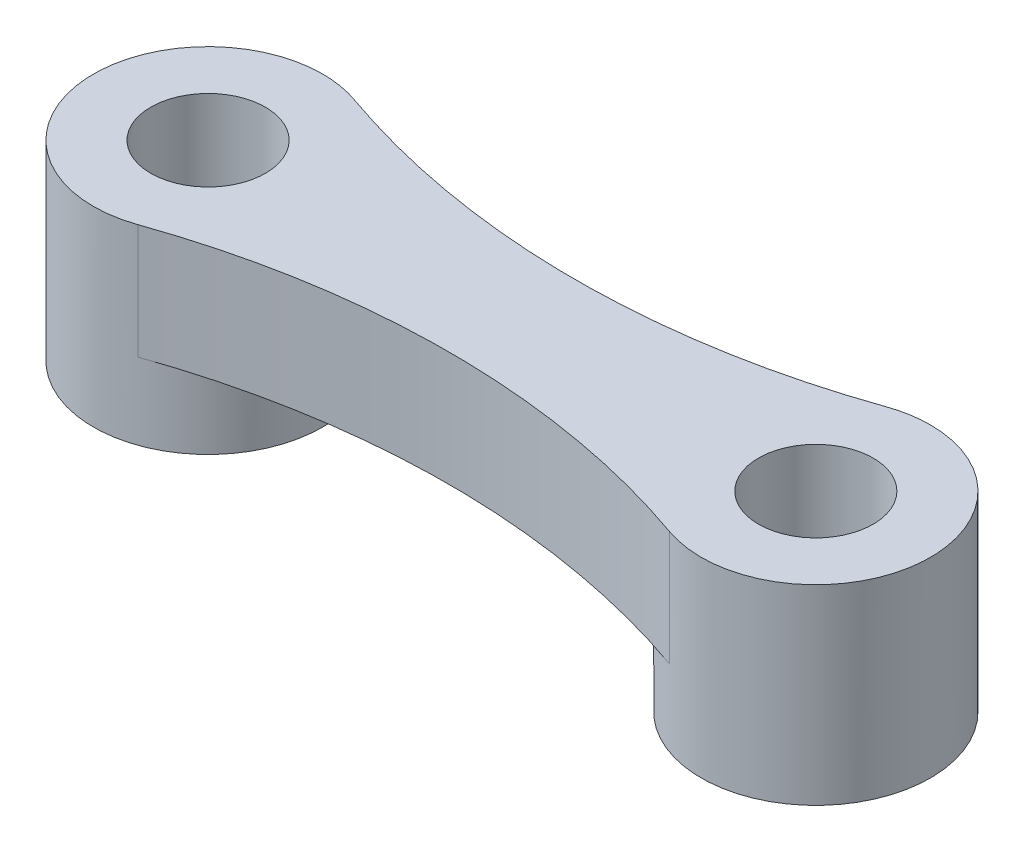
ISO-10303-21;
HEADER;
FILE_DESCRIPTION(('STEP AP214'),'2;1');
FILE_NAME('part.step','',(''),(''),'','','');
FILE_SCHEMA(('AUTOMOTIVE_DESIGN { 1 0 10303 214 1 1 1 1 }'));
ENDSEC;
DATA;
#1=APPLICATION_CONTEXT('core data for automotive mechanical design processes');
#2=APPLICATION_PROTOCOL_DEFINITION('international standard','automotive_design',2000,#1);
#3=PRODUCT_CONTEXT('',#1,'mechanical');
#4=PRODUCT('Part','Part','',(#3));
#5=PRODUCT_RELATED_PRODUCT_CATEGORY('part','',(#4));
#6=PRODUCT_DEFINITION_FORMATION('','',#4);
#7=PRODUCT_DEFINITION_CONTEXT('part definition',#1,'design');
#8=PRODUCT_DEFINITION('design','',#6,#7);
#9=PRODUCT_DEFINITION_SHAPE('','',#8);
#10=(LENGTH_UNIT() NAMED_UNIT(*) SI_UNIT(.MILLI.,.METRE.));
#11=(NAMED_UNIT(*) PLANE_ANGLE_UNIT() SI_UNIT($,.RADIAN.));
#12=(NAMED_UNIT(*) SI_UNIT($,.STERADIAN.) SOLID_ANGLE_UNIT());
#13=UNCERTAINTY_MEASURE_WITH_UNIT(LENGTH_MEASURE(1.E-05),#10,'distance_accuracy_value','');
#14=(GEOMETRIC_REPRESENTATION_CONTEXT(3) GLOBAL_UNCERTAINTY_ASSIGNED_CONTEXT((#13)) GLOBAL_UNIT_ASSIGNED_CONTEXT((#10,
#11,#12)) REPRESENTATION_CONTEXT('',''));
#15=CARTESIAN_POINT('',(0.,0.,0.));
#16=DIRECTION('',(0.,0.,1.));
#17=DIRECTION('',(1.,0.,0.));
#18=AXIS2_PLACEMENT_3D('',#15,#16,#17);
#19=CARTESIAN_POINT('',(-3.97499999999501,0.,-11.3225162840142));
#20=DIRECTION('',(0.,-1.,0.));
#21=DIRECTION('',(0.,0.,-1.));
#22=AXIS2_PLACEMENT_3D('',#19,#20,#21);
#23=PLANE('',#22);
#24=CARTESIAN_POINT('',(0.,0.,22.645032568));
#25=DIRECTION('',(0.,1.,0.));
#26=DIRECTION('',(0.,0.,1.));
#27=AXIS2_PLACEMENT_3D('',#24,#25,#26);
#28=CIRCLE('',#27,21.0000000000602);
#29=CARTESIAN_POINT('',(6.95624999994292,0.,2.83062907096401));
#30=VERTEX_POINT('',#29);
#31=CARTESIAN_POINT('',(-6.95624999998503,0.,2.83062907104261));
#32=VERTEX_POINT('',#31);
#33=EDGE_CURVE('E84',#30,#32,#28,.T.);
#34=ORIENTED_EDGE('',*,*,#33,.T.);
#35=CARTESIAN_POINT('',(-7.95,0.,0.));
#36=DIRECTION('',(0.,-1.,0.));
#37=DIRECTION('',(0.,0.,-1.));
#38=AXIS2_PLACEMENT_3D('',#35,#36,#37);
#39=CIRCLE('',#38,3.);
#40=CARTESIAN_POINT('',(-6.95625000000499,0.,-2.8306290709858));
#41=VERTEX_POINT('',#40);
#42=EDGE_CURVE('E135',#41,#32,#39,.T.);
#43=ORIENTED_EDGE('',*,*,#42,.F.);
#44=CARTESIAN_POINT('',(9.97812943381869E-12,0.,-22.6450325680284));
#45=DIRECTION('',(0.,1.,0.));
#46=DIRECTION('',(0.,0.,1.));
#47=AXIS2_PLACEMENT_3D('',#44,#45,#46);
#48=CIRCLE('',#47,21.0000000000903);
#49=CARTESIAN_POINT('',(6.95624999992546,0.,-2.83062907101469));
#50=VERTEX_POINT('',#49);
#51=EDGE_CURVE('E119',#41,#50,#48,.T.);
#52=ORIENTED_EDGE('',*,*,#51,.T.);
#53=CARTESIAN_POINT('',(7.95,0.,0.));
#54=DIRECTION('',(0.,-1.,0.));
#55=DIRECTION('',(0.,0.,-1.));
#56=AXIS2_PLACEMENT_3D('',#53,#54,#55);
#57=CIRCLE('',#56,3.);
#58=EDGE_CURVE('E98',#30,#50,#57,.T.);
#59=ORIENTED_EDGE('',*,*,#58,.F.);
#60=EDGE_LOOP('',(#34,#43,#52,#59));
#61=FACE_BOUND('',#60,.T.);
#62=ADVANCED_FACE('F45',(#61),#23,.T.);
#63=CARTESIAN_POINT('',(-7.95,3.,0.));
#64=DIRECTION('',(0.,-1.,0.));
#65=DIRECTION('',(0.,0.,-1.));
#66=AXIS2_PLACEMENT_3D('',#63,#64,#65);
#67=CYLINDRICAL_SURFACE('',#66,3.00000000006022);
#68=DIRECTION('',(0.,-1.,0.));
#69=VECTOR('',#68,1.);
#70=CARTESIAN_POINT('',(-6.95624999998504,3.,-2.83062907104261));
#71=LINE('',#70,#69);
#72=CARTESIAN_POINT('',(-6.95624999998504,3.,-2.83062907104261));
#73=VERTEX_POINT('',#72);
#74=EDGE_CURVE('E49',#73,#41,#71,.T.);
#75=ORIENTED_EDGE('',*,*,#74,.T.);
#76=ORIENTED_EDGE('',*,*,#42,.T.);
#77=DIRECTION('',(0.,-1.,0.));
#78=VECTOR('',#77,1.);
#79=CARTESIAN_POINT('',(-6.95624999998503,3.,2.83062907104261));
#80=LINE('',#79,#78);
#81=CARTESIAN_POINT('',(-6.95624999998503,3.,2.83062907104261));
#82=VERTEX_POINT('',#81);
#83=EDGE_CURVE('E11',#82,#32,#80,.T.);
#84=ORIENTED_EDGE('',*,*,#83,.F.);
#85=CARTESIAN_POINT('',(-7.95,3.,0.));
#86=DIRECTION('',(0.,-1.,0.));
#87=DIRECTION('',(0.,0.,-1.));
#88=AXIS2_PLACEMENT_3D('',#85,#86,#87);
#89=CIRCLE('',#88,3.00000000006022);
#90=EDGE_CURVE('E111',#82,#73,#89,.T.);
#91=ORIENTED_EDGE('',*,*,#90,.T.);
#92=EDGE_LOOP('',(#75,#76,#84,#91));
#93=FACE_BOUND('',#92,.T.);
#94=CARTESIAN_POINT('',(-7.95,-2.,0.));
#95=DIRECTION('',(0.,-1.,0.));
#96=DIRECTION('',(0.,0.,-1.));
#97=AXIS2_PLACEMENT_3D('',#94,#95,#96);
#98=CIRCLE('',#97,3.);
#99=CARTESIAN_POINT('',(-7.95,-2.,-3.));
#100=VERTEX_POINT('',#99);
#101=EDGE_CURVE('E129',#100,#100,#98,.T.);
#102=ORIENTED_EDGE('',*,*,#101,.F.);
#103=EDGE_LOOP('',(#102));
#104=FACE_BOUND('',#103,.T.);
#105=ADVANCED_FACE('F47',(#93,#104),#67,.T.);
#106=CARTESIAN_POINT('',(0.,3.,22.645032568));
#107=DIRECTION('',(0.,-1.,0.));
#108=DIRECTION('',(0.,0.,-1.));
#109=AXIS2_PLACEMENT_3D('',#106,#107,#108);
#110=CYLINDRICAL_SURFACE('',#109,21.0000000000602);
#111=ORIENTED_EDGE('',*,*,#33,.F.);
#112=DIRECTION('',(0.,-1.,0.));
#113=VECTOR('',#112,1.);
#114=CARTESIAN_POINT('',(6.95624999992297,3.,2.83062907102082));
#115=LINE('',#114,#113);
#116=CARTESIAN_POINT('',(6.95624999992297,3.,2.83062907102082));
#117=VERTEX_POINT('',#116);
#118=EDGE_CURVE('E56',#117,#30,#115,.T.);
#119=ORIENTED_EDGE('',*,*,#118,.F.);
#120=CARTESIAN_POINT('',(0.,3.,22.645032568));
#121=DIRECTION('',(0.,1.,0.));
#122=DIRECTION('',(0.,0.,1.));
#123=AXIS2_PLACEMENT_3D('',#120,#121,#122);
#124=CIRCLE('',#123,21.0000000000602);
#125=EDGE_CURVE('E105',#117,#82,#124,.T.);
#126=ORIENTED_EDGE('',*,*,#125,.T.);
#127=ORIENTED_EDGE('',*,*,#83,.T.);
#128=EDGE_LOOP('',(#111,#119,#126,#127));
#129=FACE_BOUND('',#128,.T.);
#130=ADVANCED_FACE('F185',(#129),#110,.F.);
#131=CARTESIAN_POINT('',(7.94999999991909,3.,3.50267000011644E-12));
#132=DIRECTION('',(0.,-1.,0.));
#133=DIRECTION('',(0.,0.,-1.));
#134=AXIS2_PLACEMENT_3D('',#131,#132,#133);
#135=CYLINDRICAL_SURFACE('',#134,3.00000000003011);
#136=ORIENTED_EDGE('',*,*,#118,.T.);
#137=ORIENTED_EDGE('',*,*,#58,.T.);
#138=DIRECTION('',(0.,-1.,0.));
#139=VECTOR('',#138,1.);
#140=CARTESIAN_POINT('',(6.95624999992546,3.,-2.83062907101469));
#141=LINE('',#140,#139);
#142=CARTESIAN_POINT('',(6.95624999992546,3.,-2.83062907101469));
#143=VERTEX_POINT('',#142);
#144=EDGE_CURVE('E76',#143,#50,#141,.T.);
#145=ORIENTED_EDGE('',*,*,#144,.F.);
#146=CARTESIAN_POINT('',(7.94999999991909,3.,3.50267000011644E-12));
#147=DIRECTION('',(0.,-1.,0.));
#148=DIRECTION('',(0.,0.,-1.));
#149=AXIS2_PLACEMENT_3D('',#146,#147,#148);
#150=CIRCLE('',#149,3.00000000003011);
#151=EDGE_CURVE('E95',#143,#117,#150,.T.);
#152=ORIENTED_EDGE('',*,*,#151,.T.);
#153=EDGE_LOOP('',(#136,#137,#145,#152));
#154=FACE_BOUND('',#153,.T.);
#155=CARTESIAN_POINT('',(7.95,-2.,0.));
#156=DIRECTION('',(0.,-1.,0.));
#157=DIRECTION('',(0.,0.,-1.));
#158=AXIS2_PLACEMENT_3D('',#155,#156,#157);
#159=CIRCLE('',#158,3.);
#160=CARTESIAN_POINT('',(7.95,-2.,-3.));
#161=VERTEX_POINT('',#160);
#162=EDGE_CURVE('E122',#161,#161,#159,.T.);
#163=ORIENTED_EDGE('',*,*,#162,.F.);
#164=EDGE_LOOP('',(#163));
#165=FACE_BOUND('',#164,.T.);
#166=ADVANCED_FACE('F93',(#154,#165),#135,.T.);
#167=CARTESIAN_POINT('',(9.97812943381869E-12,3.,-22.6450325680284));
#168=DIRECTION('',(0.,-1.,0.));
#169=DIRECTION('',(0.,0.,-1.));
#170=AXIS2_PLACEMENT_3D('',#167,#168,#169);
#171=CYLINDRICAL_SURFACE('',#170,21.0000000000903);
#172=ORIENTED_EDGE('',*,*,#51,.F.);
#173=ORIENTED_EDGE('',*,*,#74,.F.);
#174=CARTESIAN_POINT('',(9.97812943381869E-12,3.,-22.6450325680284));
#175=DIRECTION('',(0.,1.,0.));
#176=DIRECTION('',(0.,0.,1.));
#177=AXIS2_PLACEMENT_3D('',#174,#175,#176);
#178=CIRCLE('',#177,21.0000000000903);
#179=EDGE_CURVE('E103',#73,#143,#178,.T.);
#180=ORIENTED_EDGE('',*,*,#179,.T.);
#181=ORIENTED_EDGE('',*,*,#144,.T.);
#182=EDGE_LOOP('',(#172,#173,#180,#181));
#183=FACE_BOUND('',#182,.T.);
#184=ADVANCED_FACE('F108',(#183),#171,.F.);
#185=CARTESIAN_POINT('',(-3.97499999999501,3.,-11.3225162840142));
#186=DIRECTION('',(0.,-1.,0.));
#187=DIRECTION('',(0.,0.,-1.));
#188=AXIS2_PLACEMENT_3D('',#185,#186,#187);
#189=PLANE('',#188);
#190=CARTESIAN_POINT('',(-7.95,3.,0.));
#191=DIRECTION('',(0.,1.,0.));
#192=DIRECTION('',(0.,0.,1.));
#193=AXIS2_PLACEMENT_3D('',#190,#191,#192);
#194=CIRCLE('',#193,1.49999999999999);
#195=CARTESIAN_POINT('',(-7.95,3.,1.49999999999999));
#196=VERTEX_POINT('',#195);
#197=EDGE_CURVE('E152',#196,#196,#194,.T.);
#198=ORIENTED_EDGE('',*,*,#197,.F.);
#199=EDGE_LOOP('',(#198));
#200=FACE_BOUND('',#199,.T.);
#201=CARTESIAN_POINT('',(7.95,3.,0.));
#202=DIRECTION('',(0.,1.,0.));
#203=DIRECTION('',(0.,0.,1.));
#204=AXIS2_PLACEMENT_3D('',#201,#202,#203);
#205=CIRCLE('',#204,1.49999999999999);
#206=CARTESIAN_POINT('',(7.95,3.,1.49999999999999));
#207=VERTEX_POINT('',#206);
#208=EDGE_CURVE('E144',#207,#207,#205,.T.);
#209=ORIENTED_EDGE('',*,*,#208,.F.);
#210=EDGE_LOOP('',(#209));
#211=FACE_BOUND('',#210,.T.);
#212=ORIENTED_EDGE('',*,*,#90,.F.);
#213=ORIENTED_EDGE('',*,*,#125,.F.);
#214=ORIENTED_EDGE('',*,*,#151,.F.);
#215=ORIENTED_EDGE('',*,*,#179,.F.);
#216=EDGE_LOOP('',(#212,#213,#214,#215));
#217=FACE_BOUND('',#216,.T.);
#218=ADVANCED_FACE('F102',(#200,#211,#217),#189,.F.);
#219=CARTESIAN_POINT('',(7.95,-2.,0.));
#220=DIRECTION('',(0.,-1.,0.));
#221=DIRECTION('',(0.,0.,-1.));
#222=AXIS2_PLACEMENT_3D('',#219,#220,#221);
#223=PLANE('',#222);
#224=CARTESIAN_POINT('',(7.95,-2.,0.));
#225=DIRECTION('',(0.,1.,0.));
#226=DIRECTION('',(0.,0.,1.));
#227=AXIS2_PLACEMENT_3D('',#224,#225,#226);
#228=CIRCLE('',#227,1.49999999999999);
#229=CARTESIAN_POINT('',(7.95,-2.,1.49999999999999));
#230=VERTEX_POINT('',#229);
#231=EDGE_CURVE('E139',#230,#230,#228,.T.);
#232=ORIENTED_EDGE('',*,*,#231,.T.);
#233=EDGE_LOOP('',(#232));
#234=FACE_BOUND('',#233,.T.);
#235=ORIENTED_EDGE('',*,*,#162,.T.);
#236=EDGE_LOOP('',(#235));
#237=FACE_BOUND('',#236,.T.);
#238=ADVANCED_FACE('F161',(#234,#237),#223,.T.);
#239=CARTESIAN_POINT('',(-7.95,-2.,0.));
#240=DIRECTION('',(0.,-1.,0.));
#241=DIRECTION('',(0.,0.,-1.));
#242=AXIS2_PLACEMENT_3D('',#239,#240,#241);
#243=PLANE('',#242);
#244=CARTESIAN_POINT('',(-7.95,-2.,0.));
#245=DIRECTION('',(0.,1.,0.));
#246=DIRECTION('',(0.,0.,1.));
#247=AXIS2_PLACEMENT_3D('',#244,#245,#246);
#248=CIRCLE('',#247,1.49999999999999);
#249=CARTESIAN_POINT('',(-7.95,-2.,1.49999999999999));
#250=VERTEX_POINT('',#249);
#251=EDGE_CURVE('E148',#250,#250,#248,.T.);
#252=ORIENTED_EDGE('',*,*,#251,.T.);
#253=EDGE_LOOP('',(#252));
#254=FACE_BOUND('',#253,.T.);
#255=ORIENTED_EDGE('',*,*,#101,.T.);
#256=EDGE_LOOP('',(#255));
#257=FACE_BOUND('',#256,.T.);
#258=ADVANCED_FACE('F167',(#254,#257),#243,.T.);
#259=CARTESIAN_POINT('',(7.95,3.,0.));
#260=DIRECTION('',(0.,1.,0.));
#261=DIRECTION('',(0.,0.,1.));
#262=AXIS2_PLACEMENT_3D('',#259,#260,#261);
#263=CYLINDRICAL_SURFACE('',#262,1.49999999999999);
#264=ORIENTED_EDGE('',*,*,#231,.F.);
#265=EDGE_LOOP('',(#264));
#266=FACE_BOUND('',#265,.T.);
#267=ORIENTED_EDGE('',*,*,#208,.T.);
#268=EDGE_LOOP('',(#267));
#269=FACE_BOUND('',#268,.T.);
#270=ADVANCED_FACE('F165',(#266,#269),#263,.F.);
#271=CARTESIAN_POINT('',(-7.95,3.,0.));
#272=DIRECTION('',(0.,1.,0.));
#273=DIRECTION('',(0.,0.,1.));
#274=AXIS2_PLACEMENT_3D('',#271,#272,#273);
#275=CYLINDRICAL_SURFACE('',#274,1.49999999999999);
#276=ORIENTED_EDGE('',*,*,#251,.F.);
#277=EDGE_LOOP('',(#276));
#278=FACE_BOUND('',#277,.T.);
#279=ORIENTED_EDGE('',*,*,#197,.T.);
#280=EDGE_LOOP('',(#279));
#281=FACE_BOUND('',#280,.T.);
#282=ADVANCED_FACE('F157',(#278,#281),#275,.F.);
#283=CLOSED_SHELL('',(#62,#105,#130,#166,#184,#218,#238,#258,#270,#282));
#284=MANIFOLD_SOLID_BREP('B2',#283);
#285=ADVANCED_BREP_SHAPE_REPRESENTATION('',(#18,#284),#14);
#286=SHAPE_DEFINITION_REPRESENTATION(#9,#285);
ENDSEC;
END-ISO-10303-21;
